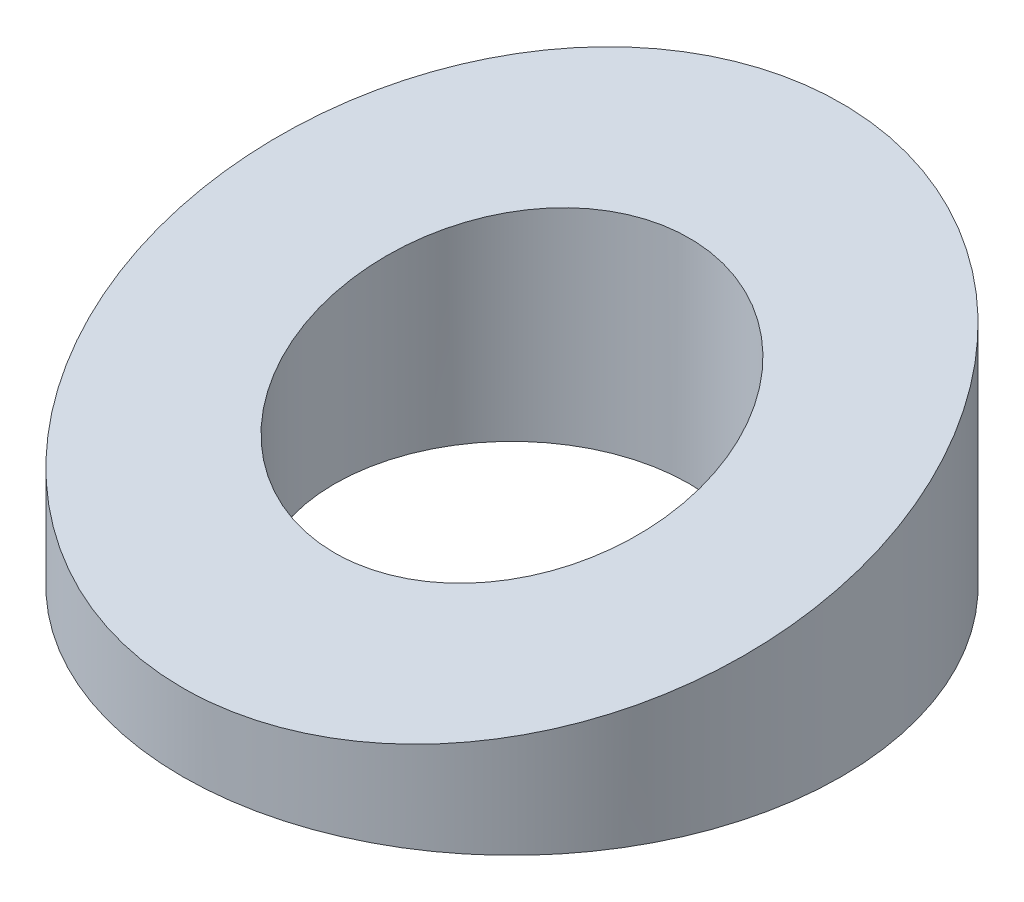
ISO-10303-21;
HEADER;
FILE_DESCRIPTION(('STEP AP214'),'2;1');
FILE_NAME('part.step','',(''),(''),'','','');
FILE_SCHEMA(('AUTOMOTIVE_DESIGN { 1 0 10303 214 1 1 1 1 }'));
ENDSEC;
DATA;
#1=APPLICATION_CONTEXT('core data for automotive mechanical design processes');
#2=APPLICATION_PROTOCOL_DEFINITION('international standard','automotive_design',2000,#1);
#3=PRODUCT_CONTEXT('',#1,'mechanical');
#4=PRODUCT('Part','Part','',(#3));
#5=PRODUCT_RELATED_PRODUCT_CATEGORY('part','',(#4));
#6=PRODUCT_DEFINITION_FORMATION('','',#4);
#7=PRODUCT_DEFINITION_CONTEXT('part definition',#1,'design');
#8=PRODUCT_DEFINITION('design','',#6,#7);
#9=PRODUCT_DEFINITION_SHAPE('','',#8);
#10=(LENGTH_UNIT() NAMED_UNIT(*) SI_UNIT(.MILLI.,.METRE.));
#11=(NAMED_UNIT(*) PLANE_ANGLE_UNIT() SI_UNIT($,.RADIAN.));
#12=(NAMED_UNIT(*) SI_UNIT($,.STERADIAN.) SOLID_ANGLE_UNIT());
#13=UNCERTAINTY_MEASURE_WITH_UNIT(LENGTH_MEASURE(1.E-05),#10,'distance_accuracy_value','');
#14=(GEOMETRIC_REPRESENTATION_CONTEXT(3) GLOBAL_UNCERTAINTY_ASSIGNED_CONTEXT((#13)) GLOBAL_UNIT_ASSIGNED_CONTEXT((#10,
#11,#12)) REPRESENTATION_CONTEXT('',''));
#15=CARTESIAN_POINT('',(0.,0.,0.));
#16=DIRECTION('',(0.,0.,1.));
#17=DIRECTION('',(1.,0.,0.));
#18=AXIS2_PLACEMENT_3D('',#15,#16,#17);
#19=CARTESIAN_POINT('',(0.,0.,0.));
#20=DIRECTION('',(0.,1.,0.));
#21=DIRECTION('',(0.,0.,1.));
#22=AXIS2_PLACEMENT_3D('',#19,#20,#21);
#23=PLANE('',#22);
#24=CARTESIAN_POINT('',(0.,0.,0.));
#25=DIRECTION('',(0.,1.,0.));
#26=DIRECTION('',(0.,0.,1.));
#27=AXIS2_PLACEMENT_3D('',#24,#25,#26);
#28=CIRCLE('',#27,6.5);
#29=CARTESIAN_POINT('',(0.,0.,6.5));
#30=VERTEX_POINT('',#29);
#31=EDGE_CURVE('E10',#30,#30,#28,.T.);
#32=ORIENTED_EDGE('',*,*,#31,.F.);
#33=EDGE_LOOP('',(#32));
#34=FACE_BOUND('',#33,.T.);
#35=CARTESIAN_POINT('',(0.,0.,0.));
#36=DIRECTION('',(0.,1.,0.));
#37=DIRECTION('',(0.,0.,1.));
#38=AXIS2_PLACEMENT_3D('',#35,#36,#37);
#39=CIRCLE('',#38,3.5);
#40=CARTESIAN_POINT('',(0.,0.,3.5));
#41=VERTEX_POINT('',#40);
#42=EDGE_CURVE('E50',#41,#41,#39,.T.);
#43=ORIENTED_EDGE('',*,*,#42,.T.);
#44=EDGE_LOOP('',(#43));
#45=FACE_BOUND('',#44,.T.);
#46=ADVANCED_FACE('F41',(#34,#45),#23,.F.);
#47=CARTESIAN_POINT('',(0.,5.,0.));
#48=DIRECTION('',(0.,-1.,0.));
#49=DIRECTION('',(0.,0.,-1.));
#50=AXIS2_PLACEMENT_3D('',#47,#48,#49);
#51=CYLINDRICAL_SURFACE('',#50,6.5);
#52=CARTESIAN_POINT('',(0.,3.2583302491977,0.));
#53=DIRECTION('',(0.,-0.965925826289068,-0.258819045102522));
#54=DIRECTION('',(0.,-0.258819045102522,0.965925826289068));
#55=AXIS2_PLACEMENT_3D('',#52,#53,#54);
#56=ELLIPSE('',#55,6.72929517266554,6.5);
#57=CARTESIAN_POINT('',(0.,1.51666049839539,6.5));
#58=VERTEX_POINT('',#57);
#59=EDGE_CURVE('E57',#58,#58,#56,.T.);
#60=ORIENTED_EDGE('',*,*,#59,.T.);
#61=EDGE_LOOP('',(#60));
#62=FACE_BOUND('',#61,.T.);
#63=ORIENTED_EDGE('',*,*,#31,.T.);
#64=EDGE_LOOP('',(#63));
#65=FACE_BOUND('',#64,.T.);
#66=ADVANCED_FACE('F43',(#62,#65),#51,.T.);
#67=CARTESIAN_POINT('',(0.,5.,0.));
#68=DIRECTION('',(0.,-1.,0.));
#69=DIRECTION('',(0.,0.,-1.));
#70=AXIS2_PLACEMENT_3D('',#67,#68,#69);
#71=CYLINDRICAL_SURFACE('',#70,3.5);
#72=CARTESIAN_POINT('',(0.,3.2583302491977,0.));
#73=DIRECTION('',(0.,-0.965925826289068,-0.258819045102522));
#74=DIRECTION('',(0.,-0.258819045102522,0.965925826289068));
#75=AXIS2_PLACEMENT_3D('',#72,#73,#74);
#76=ELLIPSE('',#75,3.62346663143529,3.5);
#77=CARTESIAN_POINT('',(0.,2.32050807568876,3.5));
#78=VERTEX_POINT('',#77);
#79=EDGE_CURVE('E45',#78,#78,#76,.T.);
#80=ORIENTED_EDGE('',*,*,#79,.F.);
#81=EDGE_LOOP('',(#80));
#82=FACE_BOUND('',#81,.T.);
#83=ORIENTED_EDGE('',*,*,#42,.F.);
#84=EDGE_LOOP('',(#83));
#85=FACE_BOUND('',#84,.T.);
#86=ADVANCED_FACE('F72',(#82,#85),#71,.F.);
#87=CARTESIAN_POINT('',(10.,3.04006350946109,0.814582562299426));
#88=DIRECTION('',(0.,-0.965925826289068,-0.258819045102522));
#89=DIRECTION('',(0.,0.258819045102522,-0.965925826289068));
#90=AXIS2_PLACEMENT_3D('',#87,#88,#89);
#91=PLANE('',#90);
#92=ORIENTED_EDGE('',*,*,#79,.T.);
#93=EDGE_LOOP('',(#92));
#94=FACE_BOUND('',#93,.T.);
#95=ORIENTED_EDGE('',*,*,#59,.F.);
#96=EDGE_LOOP('',(#95));
#97=FACE_BOUND('',#96,.T.);
#98=ADVANCED_FACE('F69',(#94,#97),#91,.F.);
#99=CLOSED_SHELL('',(#46,#66,#86,#98));
#100=MANIFOLD_SOLID_BREP('B2',#99);
#101=ADVANCED_BREP_SHAPE_REPRESENTATION('',(#18,#100),#14);
#102=SHAPE_DEFINITION_REPRESENTATION(#9,#101);
ENDSEC;
END-ISO-10303-21;
